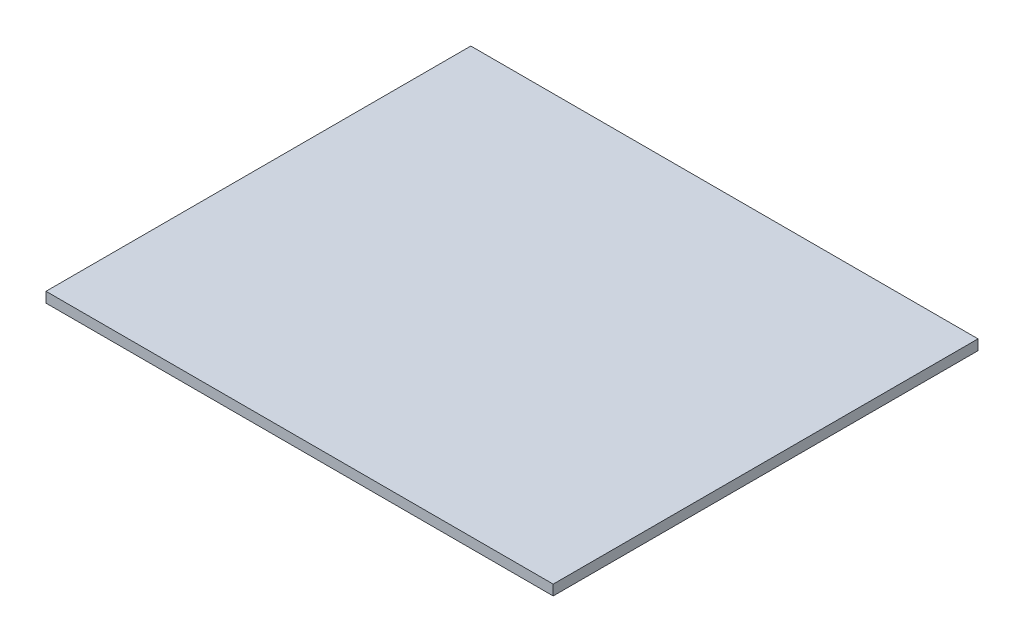
ISO-10303-21;
HEADER;
FILE_DESCRIPTION(('STEP AP214'),'2;1');
FILE_NAME('part.step','',(''),(''),'','','');
FILE_SCHEMA(('AUTOMOTIVE_DESIGN { 1 0 10303 214 1 1 1 1 }'));
ENDSEC;
DATA;
#1=APPLICATION_CONTEXT('core data for automotive mechanical design processes');
#2=APPLICATION_PROTOCOL_DEFINITION('international standard','automotive_design',2000,#1);
#3=PRODUCT_CONTEXT('',#1,'mechanical');
#4=PRODUCT('Part','Part','',(#3));
#5=PRODUCT_RELATED_PRODUCT_CATEGORY('part','',(#4));
#6=PRODUCT_DEFINITION_FORMATION('','',#4);
#7=PRODUCT_DEFINITION_CONTEXT('part definition',#1,'design');
#8=PRODUCT_DEFINITION('design','',#6,#7);
#9=PRODUCT_DEFINITION_SHAPE('','',#8);
#10=(LENGTH_UNIT() NAMED_UNIT(*) SI_UNIT(.MILLI.,.METRE.));
#11=(NAMED_UNIT(*) PLANE_ANGLE_UNIT() SI_UNIT($,.RADIAN.));
#12=(NAMED_UNIT(*) SI_UNIT($,.STERADIAN.) SOLID_ANGLE_UNIT());
#13=UNCERTAINTY_MEASURE_WITH_UNIT(LENGTH_MEASURE(1.E-05),#10,'distance_accuracy_value','');
#14=(GEOMETRIC_REPRESENTATION_CONTEXT(3) GLOBAL_UNCERTAINTY_ASSIGNED_CONTEXT((#13)) GLOBAL_UNIT_ASSIGNED_CONTEXT((#10,
#11,#12)) REPRESENTATION_CONTEXT('',''));
#15=CARTESIAN_POINT('',(0.,0.,0.));
#16=DIRECTION('',(0.,0.,1.));
#17=DIRECTION('',(1.,0.,0.));
#18=AXIS2_PLACEMENT_3D('',#15,#16,#17);
#19=CARTESIAN_POINT('',(625.475,12.7,523.875));
#20=DIRECTION('',(-1.,0.,0.));
#21=DIRECTION('',(0.,0.,1.));
#22=AXIS2_PLACEMENT_3D('',#19,#20,#21);
#23=PLANE('',#22);
#24=DIRECTION('',(0.,0.,-1.));
#25=VECTOR('',#24,1.);
#26=CARTESIAN_POINT('',(625.475,0.,523.875));
#27=LINE('',#26,#25);
#28=CARTESIAN_POINT('',(625.475,0.,523.875));
#29=VERTEX_POINT('',#28);
#30=CARTESIAN_POINT('',(625.475,0.,0.));
#31=VERTEX_POINT('',#30);
#32=EDGE_CURVE('E96',#29,#31,#27,.T.);
#33=ORIENTED_EDGE('',*,*,#32,.T.);
#34=DIRECTION('',(0.,-1.,0.));
#35=VECTOR('',#34,1.);
#36=CARTESIAN_POINT('',(625.475,12.7,0.));
#37=LINE('',#36,#35);
#38=CARTESIAN_POINT('',(625.475,12.7,0.));
#39=VERTEX_POINT('',#38);
#40=EDGE_CURVE('E11',#39,#31,#37,.T.);
#41=ORIENTED_EDGE('',*,*,#40,.F.);
#42=DIRECTION('',(0.,0.,-1.));
#43=VECTOR('',#42,1.);
#44=CARTESIAN_POINT('',(625.475,12.7,523.875));
#45=LINE('',#44,#43);
#46=CARTESIAN_POINT('',(625.475,12.7,523.875));
#47=VERTEX_POINT('',#46);
#48=EDGE_CURVE('E84',#47,#39,#45,.T.);
#49=ORIENTED_EDGE('',*,*,#48,.F.);
#50=DIRECTION('',(0.,-1.,0.));
#51=VECTOR('',#50,1.);
#52=CARTESIAN_POINT('',(625.475,12.7,523.875));
#53=LINE('',#52,#51);
#54=EDGE_CURVE('E92',#47,#29,#53,.T.);
#55=ORIENTED_EDGE('',*,*,#54,.T.);
#56=EDGE_LOOP('',(#33,#41,#49,#55));
#57=FACE_BOUND('',#56,.T.);
#58=ADVANCED_FACE('F33',(#57),#23,.F.);
#59=CARTESIAN_POINT('',(0.,12.7,0.));
#60=DIRECTION('',(0.,0.,1.));
#61=DIRECTION('',(1.,0.,0.));
#62=AXIS2_PLACEMENT_3D('',#59,#60,#61);
#63=PLANE('',#62);
#64=DIRECTION('',(-1.,0.,0.));
#65=VECTOR('',#64,1.);
#66=CARTESIAN_POINT('',(0.,0.,0.));
#67=LINE('',#66,#65);
#68=CARTESIAN_POINT('',(0.,0.,0.));
#69=VERTEX_POINT('',#68);
#70=EDGE_CURVE('E88',#31,#69,#67,.T.);
#71=ORIENTED_EDGE('',*,*,#70,.T.);
#72=DIRECTION('',(0.,-1.,0.));
#73=VECTOR('',#72,1.);
#74=CARTESIAN_POINT('',(0.,12.7,0.));
#75=LINE('',#74,#73);
#76=CARTESIAN_POINT('',(0.,12.7,0.));
#77=VERTEX_POINT('',#76);
#78=EDGE_CURVE('E41',#77,#69,#75,.T.);
#79=ORIENTED_EDGE('',*,*,#78,.F.);
#80=DIRECTION('',(-1.,0.,0.));
#81=VECTOR('',#80,1.);
#82=CARTESIAN_POINT('',(0.,12.7,0.));
#83=LINE('',#82,#81);
#84=EDGE_CURVE('E79',#39,#77,#83,.T.);
#85=ORIENTED_EDGE('',*,*,#84,.F.);
#86=ORIENTED_EDGE('',*,*,#40,.T.);
#87=EDGE_LOOP('',(#71,#79,#85,#86));
#88=FACE_BOUND('',#87,.T.);
#89=ADVANCED_FACE('F87',(#88),#63,.F.);
#90=CARTESIAN_POINT('',(0.,12.7,523.875));
#91=DIRECTION('',(1.,0.,0.));
#92=DIRECTION('',(0.,0.,-1.));
#93=AXIS2_PLACEMENT_3D('',#90,#91,#92);
#94=PLANE('',#93);
#95=DIRECTION('',(0.,0.,1.));
#96=VECTOR('',#95,1.);
#97=CARTESIAN_POINT('',(0.,0.,523.875));
#98=LINE('',#97,#96);
#99=CARTESIAN_POINT('',(0.,0.,523.875));
#100=VERTEX_POINT('',#99);
#101=EDGE_CURVE('E66',#69,#100,#98,.T.);
#102=ORIENTED_EDGE('',*,*,#101,.T.);
#103=DIRECTION('',(0.,-1.,0.));
#104=VECTOR('',#103,1.);
#105=CARTESIAN_POINT('',(0.,12.7,523.875));
#106=LINE('',#105,#104);
#107=CARTESIAN_POINT('',(0.,12.7,523.875));
#108=VERTEX_POINT('',#107);
#109=EDGE_CURVE('E89',#108,#100,#106,.T.);
#110=ORIENTED_EDGE('',*,*,#109,.F.);
#111=DIRECTION('',(0.,0.,1.));
#112=VECTOR('',#111,1.);
#113=CARTESIAN_POINT('',(0.,12.7,523.875));
#114=LINE('',#113,#112);
#115=EDGE_CURVE('E82',#77,#108,#114,.T.);
#116=ORIENTED_EDGE('',*,*,#115,.F.);
#117=ORIENTED_EDGE('',*,*,#78,.T.);
#118=EDGE_LOOP('',(#102,#110,#116,#117));
#119=FACE_BOUND('',#118,.T.);
#120=ADVANCED_FACE('F90',(#119),#94,.F.);
#121=CARTESIAN_POINT('',(0.,12.7,523.875));
#122=DIRECTION('',(0.,0.,-1.));
#123=DIRECTION('',(-1.,0.,0.));
#124=AXIS2_PLACEMENT_3D('',#121,#122,#123);
#125=PLANE('',#124);
#126=DIRECTION('',(1.,0.,0.));
#127=VECTOR('',#126,1.);
#128=CARTESIAN_POINT('',(0.,0.,523.875));
#129=LINE('',#128,#127);
#130=EDGE_CURVE('E72',#100,#29,#129,.T.);
#131=ORIENTED_EDGE('',*,*,#130,.T.);
#132=ORIENTED_EDGE('',*,*,#54,.F.);
#133=DIRECTION('',(1.,0.,0.));
#134=VECTOR('',#133,1.);
#135=CARTESIAN_POINT('',(0.,12.7,523.875));
#136=LINE('',#135,#134);
#137=EDGE_CURVE('E49',#108,#47,#136,.T.);
#138=ORIENTED_EDGE('',*,*,#137,.F.);
#139=ORIENTED_EDGE('',*,*,#109,.T.);
#140=EDGE_LOOP('',(#131,#132,#138,#139));
#141=FACE_BOUND('',#140,.T.);
#142=ADVANCED_FACE('F103',(#141),#125,.F.);
#143=CARTESIAN_POINT('',(0.,12.7,0.));
#144=DIRECTION('',(0.,-1.,0.));
#145=DIRECTION('',(0.,0.,-1.));
#146=AXIS2_PLACEMENT_3D('',#143,#144,#145);
#147=PLANE('',#146);
#148=ORIENTED_EDGE('',*,*,#48,.T.);
#149=ORIENTED_EDGE('',*,*,#84,.T.);
#150=ORIENTED_EDGE('',*,*,#115,.T.);
#151=ORIENTED_EDGE('',*,*,#137,.T.);
#152=EDGE_LOOP('',(#148,#149,#150,#151));
#153=FACE_BOUND('',#152,.T.);
#154=ADVANCED_FACE('F80',(#153),#147,.F.);
#155=CARTESIAN_POINT('',(0.,0.,0.));
#156=DIRECTION('',(0.,-1.,0.));
#157=DIRECTION('',(0.,0.,-1.));
#158=AXIS2_PLACEMENT_3D('',#155,#156,#157);
#159=PLANE('',#158);
#160=ORIENTED_EDGE('',*,*,#32,.F.);
#161=ORIENTED_EDGE('',*,*,#130,.F.);
#162=ORIENTED_EDGE('',*,*,#101,.F.);
#163=ORIENTED_EDGE('',*,*,#70,.F.);
#164=EDGE_LOOP('',(#160,#161,#162,#163));
#165=FACE_BOUND('',#164,.T.);
#166=ADVANCED_FACE('F106',(#165),#159,.T.);
#167=CLOSED_SHELL('',(#58,#89,#120,#142,#154,#166));
#168=MANIFOLD_SOLID_BREP('B2',#167);
#169=ADVANCED_BREP_SHAPE_REPRESENTATION('',(#18,#168),#14);
#170=SHAPE_DEFINITION_REPRESENTATION(#9,#169);
ENDSEC;
END-ISO-10303-21;
